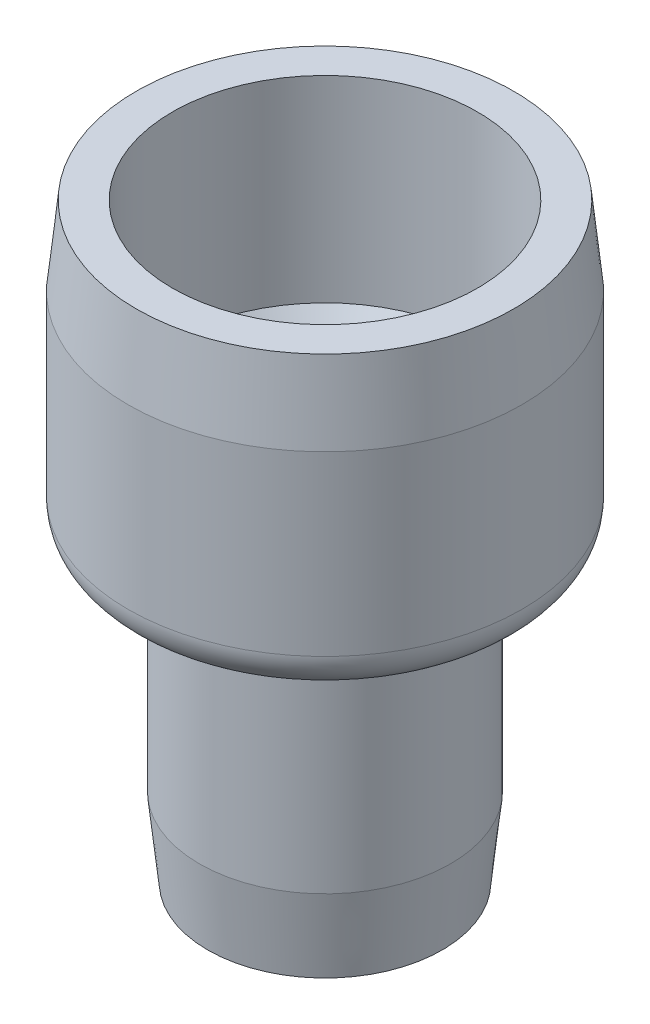
ISO-10303-21;
HEADER;
FILE_DESCRIPTION(('STEP AP214'),'2;1');
FILE_NAME('part.step','',(''),(''),'','','');
FILE_SCHEMA(('AUTOMOTIVE_DESIGN { 1 0 10303 214 1 1 1 1 }'));
ENDSEC;
DATA;
#1=APPLICATION_CONTEXT('core data for automotive mechanical design processes');
#2=APPLICATION_PROTOCOL_DEFINITION('international standard','automotive_design',2000,#1);
#3=PRODUCT_CONTEXT('',#1,'mechanical');
#4=PRODUCT('Part','Part','',(#3));
#5=PRODUCT_RELATED_PRODUCT_CATEGORY('part','',(#4));
#6=PRODUCT_DEFINITION_FORMATION('','',#4);
#7=PRODUCT_DEFINITION_CONTEXT('part definition',#1,'design');
#8=PRODUCT_DEFINITION('design','',#6,#7);
#9=PRODUCT_DEFINITION_SHAPE('','',#8);
#10=(LENGTH_UNIT() NAMED_UNIT(*) SI_UNIT(.MILLI.,.METRE.));
#11=(NAMED_UNIT(*) PLANE_ANGLE_UNIT() SI_UNIT($,.RADIAN.));
#12=(NAMED_UNIT(*) SI_UNIT($,.STERADIAN.) SOLID_ANGLE_UNIT());
#13=UNCERTAINTY_MEASURE_WITH_UNIT(LENGTH_MEASURE(1.E-05),#10,'distance_accuracy_value','');
#14=(GEOMETRIC_REPRESENTATION_CONTEXT(3) GLOBAL_UNCERTAINTY_ASSIGNED_CONTEXT((#13)) GLOBAL_UNIT_ASSIGNED_CONTEXT((#10,
#11,#12)) REPRESENTATION_CONTEXT('',''));
#15=CARTESIAN_POINT('',(0.,0.,0.));
#16=DIRECTION('',(0.,0.,1.));
#17=DIRECTION('',(1.,0.,0.));
#18=AXIS2_PLACEMENT_3D('',#15,#16,#17);
#19=CARTESIAN_POINT('',(0.,17.,0.));
#20=DIRECTION('',(0.,1.,0.));
#21=DIRECTION('',(0.,0.,1.));
#22=AXIS2_PLACEMENT_3D('',#19,#20,#21);
#23=TOROIDAL_SURFACE('',#22,8.,2.);
#24=CARTESIAN_POINT('',(0.,17.,0.));
#25=DIRECTION('',(0.,1.,0.));
#26=DIRECTION('',(0.,0.,1.));
#27=AXIS2_PLACEMENT_3D('',#24,#25,#26);
#28=CIRCLE('',#27,10.);
#29=CARTESIAN_POINT('',(0.,17.,10.));
#30=VERTEX_POINT('',#29);
#31=EDGE_CURVE('E37',#30,#30,#28,.T.);
#32=ORIENTED_EDGE('',*,*,#31,.F.);
#33=EDGE_LOOP('',(#32));
#34=FACE_BOUND('',#33,.T.);
#35=CARTESIAN_POINT('',(0.,15.,0.));
#36=DIRECTION('',(0.,1.,0.));
#37=DIRECTION('',(0.,0.,1.));
#38=AXIS2_PLACEMENT_3D('',#35,#36,#37);
#39=CIRCLE('',#38,8.);
#40=CARTESIAN_POINT('',(0.,15.,8.));
#41=VERTEX_POINT('',#40);
#42=EDGE_CURVE('E10',#41,#41,#39,.F.);
#43=ORIENTED_EDGE('',*,*,#42,.F.);
#44=EDGE_LOOP('',(#43));
#45=FACE_BOUND('',#44,.T.);
#46=ADVANCED_FACE('F31',(#34,#45),#23,.T.);
#47=CARTESIAN_POINT('',(0.,15.,0.));
#48=DIRECTION('',(0.,-1.,0.));
#49=DIRECTION('',(0.,0.,-1.));
#50=AXIS2_PLACEMENT_3D('',#47,#48,#49);
#51=CYLINDRICAL_SURFACE('',#50,6.375);
#52=CARTESIAN_POINT('',(0.,4.00000000000014,0.));
#53=DIRECTION('',(0.,1.,0.));
#54=DIRECTION('',(0.,0.,1.));
#55=AXIS2_PLACEMENT_3D('',#52,#53,#54);
#56=CIRCLE('',#55,6.375);
#57=CARTESIAN_POINT('',(0.,4.00000000000014,6.375));
#58=VERTEX_POINT('',#57);
#59=EDGE_CURVE('E45',#58,#58,#56,.T.);
#60=ORIENTED_EDGE('',*,*,#59,.T.);
#61=EDGE_LOOP('',(#60));
#62=FACE_BOUND('',#61,.T.);
#63=CARTESIAN_POINT('',(0.,15.,0.));
#64=DIRECTION('',(0.,1.,0.));
#65=DIRECTION('',(0.,0.,1.));
#66=AXIS2_PLACEMENT_3D('',#63,#64,#65);
#67=CIRCLE('',#66,6.375);
#68=CARTESIAN_POINT('',(0.,15.,6.375));
#69=VERTEX_POINT('',#68);
#70=EDGE_CURVE('E56',#69,#69,#67,.T.);
#71=ORIENTED_EDGE('',*,*,#70,.F.);
#72=EDGE_LOOP('',(#71));
#73=FACE_BOUND('',#72,.T.);
#74=ADVANCED_FACE('F78',(#62,#73),#51,.T.);
#75=CARTESIAN_POINT('',(0.,0.,0.));
#76=DIRECTION('',(0.,1.,0.));
#77=DIRECTION('',(0.,0.,1.));
#78=AXIS2_PLACEMENT_3D('',#75,#76,#77);
#79=PLANE('',#78);
#80=CARTESIAN_POINT('',(0.,0.,0.));
#81=DIRECTION('',(0.,1.,0.));
#82=DIRECTION('',(0.,0.,1.));
#83=AXIS2_PLACEMENT_3D('',#80,#81,#82);
#84=CIRCLE('',#83,5.95458305893729);
#85=CARTESIAN_POINT('',(0.,0.,5.95458305893729));
#86=VERTEX_POINT('',#85);
#87=EDGE_CURVE('E41',#86,#86,#84,.F.);
#88=ORIENTED_EDGE('',*,*,#87,.T.);
#89=EDGE_LOOP('',(#88));
#90=FACE_BOUND('',#89,.T.);
#91=CARTESIAN_POINT('',(0.,0.,0.));
#92=DIRECTION('',(0.,-1.,0.));
#93=DIRECTION('',(0.,0.,-1.));
#94=AXIS2_PLACEMENT_3D('',#91,#92,#93);
#95=CIRCLE('',#94,4.125);
#96=CARTESIAN_POINT('',(0.,0.,-4.125));
#97=VERTEX_POINT('',#96);
#98=EDGE_CURVE('E61',#97,#97,#95,.T.);
#99=ORIENTED_EDGE('',*,*,#98,.F.);
#100=EDGE_LOOP('',(#99));
#101=FACE_BOUND('',#100,.T.);
#102=ADVANCED_FACE('F75',(#90,#101),#79,.F.);
#103=CARTESIAN_POINT('',(0.,15.,0.));
#104=DIRECTION('',(0.,1.,0.));
#105=DIRECTION('',(0.,0.,1.));
#106=AXIS2_PLACEMENT_3D('',#103,#104,#105);
#107=PLANE('',#106);
#108=ORIENTED_EDGE('',*,*,#42,.T.);
#109=EDGE_LOOP('',(#108));
#110=FACE_BOUND('',#109,.T.);
#111=ORIENTED_EDGE('',*,*,#70,.T.);
#112=EDGE_LOOP('',(#111));
#113=FACE_BOUND('',#112,.T.);
#114=ADVANCED_FACE('F77',(#110,#113),#107,.F.);
#115=CARTESIAN_POINT('',(0.,30.,0.));
#116=DIRECTION('',(0.,-1.,0.));
#117=DIRECTION('',(0.,0.,-1.));
#118=AXIS2_PLACEMENT_3D('',#115,#116,#117);
#119=CYLINDRICAL_SURFACE('',#118,10.);
#120=ORIENTED_EDGE('',*,*,#31,.T.);
#121=EDGE_LOOP('',(#120));
#122=FACE_BOUND('',#121,.T.);
#123=CARTESIAN_POINT('',(0.,25.9999999999997,0.));
#124=DIRECTION('',(0.,1.,0.));
#125=DIRECTION('',(0.,0.,1.));
#126=AXIS2_PLACEMENT_3D('',#123,#124,#125);
#127=CIRCLE('',#126,10.);
#128=CARTESIAN_POINT('',(0.,25.9999999999997,10.));
#129=VERTEX_POINT('',#128);
#130=EDGE_CURVE('E50',#129,#129,#127,.F.);
#131=ORIENTED_EDGE('',*,*,#130,.T.);
#132=EDGE_LOOP('',(#131));
#133=FACE_BOUND('',#132,.T.);
#134=ADVANCED_FACE('F85',(#122,#133),#119,.T.);
#135=CARTESIAN_POINT('',(0.,30.,0.));
#136=DIRECTION('',(0.,1.,0.));
#137=DIRECTION('',(0.,0.,1.));
#138=AXIS2_PLACEMENT_3D('',#135,#136,#137);
#139=PLANE('',#138);
#140=CARTESIAN_POINT('',(0.,30.,0.));
#141=DIRECTION('',(0.,1.,0.));
#142=DIRECTION('',(0.,0.,1.));
#143=AXIS2_PLACEMENT_3D('',#140,#141,#142);
#144=CIRCLE('',#143,9.57958305893727);
#145=CARTESIAN_POINT('',(0.,30.,9.57958305893727));
#146=VERTEX_POINT('',#145);
#147=EDGE_CURVE('E53',#146,#146,#144,.T.);
#148=ORIENTED_EDGE('',*,*,#147,.T.);
#149=EDGE_LOOP('',(#148));
#150=FACE_BOUND('',#149,.T.);
#151=CARTESIAN_POINT('',(0.,30.,0.));
#152=DIRECTION('',(0.,1.,0.));
#153=DIRECTION('',(0.,0.,1.));
#154=AXIS2_PLACEMENT_3D('',#151,#152,#153);
#155=CIRCLE('',#154,7.75);
#156=CARTESIAN_POINT('',(0.,30.,7.75));
#157=VERTEX_POINT('',#156);
#158=EDGE_CURVE('E64',#157,#157,#155,.T.);
#159=ORIENTED_EDGE('',*,*,#158,.F.);
#160=EDGE_LOOP('',(#159));
#161=FACE_BOUND('',#160,.T.);
#162=ADVANCED_FACE('F146',(#150,#161),#139,.T.);
#163=CARTESIAN_POINT('',(0.,20.,0.));
#164=DIRECTION('',(0.,1.,0.));
#165=DIRECTION('',(0.,0.,1.));
#166=AXIS2_PLACEMENT_3D('',#163,#164,#165);
#167=CYLINDRICAL_SURFACE('',#166,7.75);
#168=CARTESIAN_POINT('',(0.,20.,0.));
#169=DIRECTION('',(0.,1.,0.));
#170=DIRECTION('',(0.,0.,1.));
#171=AXIS2_PLACEMENT_3D('',#168,#169,#170);
#172=CIRCLE('',#171,7.75);
#173=CARTESIAN_POINT('',(0.,20.,7.75));
#174=VERTEX_POINT('',#173);
#175=EDGE_CURVE('E60',#174,#174,#172,.T.);
#176=ORIENTED_EDGE('',*,*,#175,.F.);
#177=EDGE_LOOP('',(#176));
#178=FACE_BOUND('',#177,.T.);
#179=ORIENTED_EDGE('',*,*,#158,.T.);
#180=EDGE_LOOP('',(#179));
#181=FACE_BOUND('',#180,.T.);
#182=ADVANCED_FACE('F138',(#178,#181),#167,.F.);
#183=CARTESIAN_POINT('',(0.,20.,0.));
#184=DIRECTION('',(0.,1.,0.));
#185=DIRECTION('',(0.,0.,1.));
#186=AXIS2_PLACEMENT_3D('',#183,#184,#185);
#187=CONICAL_SURFACE('',#186,7.75,0.610865238198017);
#188=CARTESIAN_POINT('',(0.,14.8229634755598,0.));
#189=DIRECTION('',(0.,1.,0.));
#190=DIRECTION('',(0.,0.,1.));
#191=AXIS2_PLACEMENT_3D('',#188,#189,#190);
#192=CIRCLE('',#191,4.125);
#193=CARTESIAN_POINT('',(0.,14.8229634755598,4.125));
#194=VERTEX_POINT('',#193);
#195=EDGE_CURVE('E57',#194,#194,#192,.F.);
#196=ORIENTED_EDGE('',*,*,#195,.T.);
#197=EDGE_LOOP('',(#196));
#198=FACE_BOUND('',#197,.T.);
#199=ORIENTED_EDGE('',*,*,#175,.T.);
#200=EDGE_LOOP('',(#199));
#201=FACE_BOUND('',#200,.T.);
#202=ADVANCED_FACE('F131',(#198,#201),#187,.F.);
#203=CARTESIAN_POINT('',(0.,20.,0.));
#204=DIRECTION('',(0.,-1.,0.));
#205=DIRECTION('',(0.,0.,-1.));
#206=AXIS2_PLACEMENT_3D('',#203,#204,#205);
#207=CYLINDRICAL_SURFACE('',#206,4.125);
#208=ORIENTED_EDGE('',*,*,#98,.T.);
#209=EDGE_LOOP('',(#208));
#210=FACE_BOUND('',#209,.T.);
#211=ORIENTED_EDGE('',*,*,#195,.F.);
#212=EDGE_LOOP('',(#211));
#213=FACE_BOUND('',#212,.T.);
#214=ADVANCED_FACE('F72',(#210,#213),#207,.F.);
#215=CARTESIAN_POINT('',(0.,30.,0.));
#216=DIRECTION('',(0.,-1.,0.));
#217=DIRECTION('',(0.,0.,-1.));
#218=AXIS2_PLACEMENT_3D('',#215,#216,#217);
#219=CONICAL_SURFACE('',#218,9.57958305893727,0.104719755119657);
#220=ORIENTED_EDGE('',*,*,#130,.F.);
#221=EDGE_LOOP('',(#220));
#222=FACE_BOUND('',#221,.T.);
#223=ORIENTED_EDGE('',*,*,#147,.F.);
#224=EDGE_LOOP('',(#223));
#225=FACE_BOUND('',#224,.T.);
#226=ADVANCED_FACE('F107',(#222,#225),#219,.T.);
#227=CARTESIAN_POINT('',(0.,4.00000000000014,0.));
#228=DIRECTION('',(0.,1.,0.));
#229=DIRECTION('',(0.,0.,1.));
#230=AXIS2_PLACEMENT_3D('',#227,#228,#229);
#231=CONICAL_SURFACE('',#230,6.375,0.104719755119657);
#232=ORIENTED_EDGE('',*,*,#87,.F.);
#233=EDGE_LOOP('',(#232));
#234=FACE_BOUND('',#233,.T.);
#235=ORIENTED_EDGE('',*,*,#59,.F.);
#236=EDGE_LOOP('',(#235));
#237=FACE_BOUND('',#236,.T.);
#238=ADVANCED_FACE('F116',(#234,#237),#231,.T.);
#239=CLOSED_SHELL('',(#46,#74,#102,#114,#134,#162,#182,#202,#214,#226,#238));
#240=MANIFOLD_SOLID_BREP('B2',#239);
#241=ADVANCED_BREP_SHAPE_REPRESENTATION('',(#18,#240),#14);
#242=SHAPE_DEFINITION_REPRESENTATION(#9,#241);
ENDSEC;
END-ISO-10303-21;
